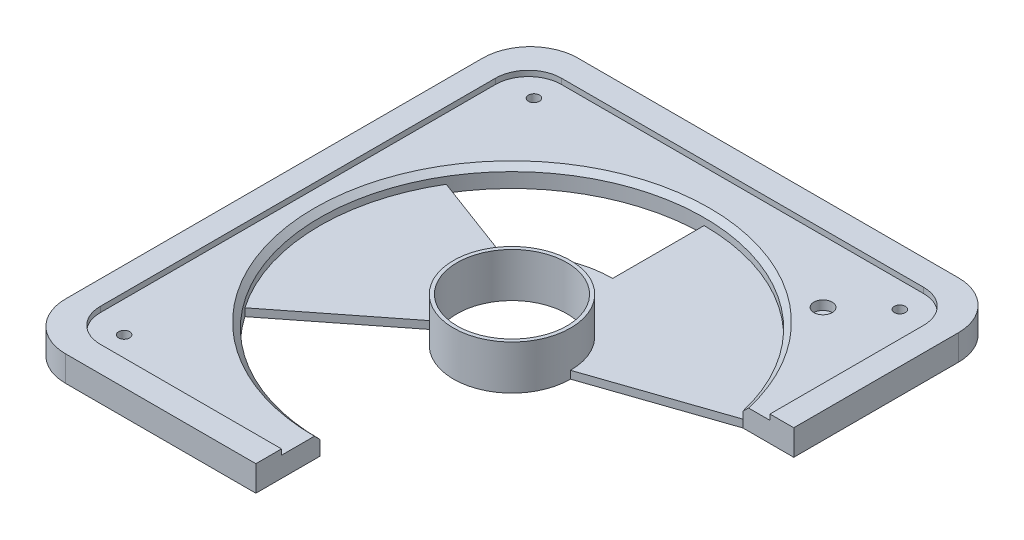
ISO-10303-21;
HEADER;
FILE_DESCRIPTION(('STEP AP214'),'2;1');
FILE_NAME('part.step','',(''),(''),'','','');
FILE_SCHEMA(('AUTOMOTIVE_DESIGN { 1 0 10303 214 1 1 1 1 }'));
ENDSEC;
DATA;
#1=APPLICATION_CONTEXT('core data for automotive mechanical design processes');
#2=APPLICATION_PROTOCOL_DEFINITION('international standard','automotive_design',2000,#1);
#3=PRODUCT_CONTEXT('',#1,'mechanical');
#4=PRODUCT('Part','Part','',(#3));
#5=PRODUCT_RELATED_PRODUCT_CATEGORY('part','',(#4));
#6=PRODUCT_DEFINITION_FORMATION('','',#4);
#7=PRODUCT_DEFINITION_CONTEXT('part definition',#1,'design');
#8=PRODUCT_DEFINITION('design','',#6,#7);
#9=PRODUCT_DEFINITION_SHAPE('','',#8);
#10=(LENGTH_UNIT() NAMED_UNIT(*) SI_UNIT(.MILLI.,.METRE.));
#11=(NAMED_UNIT(*) PLANE_ANGLE_UNIT() SI_UNIT($,.RADIAN.));
#12=(NAMED_UNIT(*) SI_UNIT($,.STERADIAN.) SOLID_ANGLE_UNIT());
#13=UNCERTAINTY_MEASURE_WITH_UNIT(LENGTH_MEASURE(1.E-05),#10,'distance_accuracy_value','');
#14=(GEOMETRIC_REPRESENTATION_CONTEXT(3) GLOBAL_UNCERTAINTY_ASSIGNED_CONTEXT((#13)) GLOBAL_UNIT_ASSIGNED_CONTEXT((#10,
#11,#12)) REPRESENTATION_CONTEXT('',''));
#15=CARTESIAN_POINT('',(0.,0.,0.));
#16=DIRECTION('',(0.,0.,1.));
#17=DIRECTION('',(1.,0.,0.));
#18=AXIS2_PLACEMENT_3D('',#15,#16,#17);
#19=CARTESIAN_POINT('',(0.,15.367,0.));
#20=DIRECTION('',(0.,-1.,0.));
#21=DIRECTION('',(0.,0.,-1.));
#22=AXIS2_PLACEMENT_3D('',#19,#20,#21);
#23=CYLINDRICAL_SURFACE('',#22,20.32);
#24=CARTESIAN_POINT('',(0.,2.667,0.));
#25=DIRECTION('',(0.,1.,0.));
#26=DIRECTION('',(0.,0.,1.));
#27=AXIS2_PLACEMENT_3D('',#24,#25,#26);
#28=CIRCLE('',#27,20.32);
#29=CARTESIAN_POINT('',(20.32,2.667,0.));
#30=VERTEX_POINT('',#29);
#31=CARTESIAN_POINT('',(-18.2721181038215,2.667,8.89));
#32=VERTEX_POINT('',#31);
#33=EDGE_CURVE('E450',#30,#32,#28,.T.);
#34=ORIENTED_EDGE('',*,*,#33,.T.);
#35=DIRECTION('',(0.,1.,0.));
#36=VECTOR('',#35,1.);
#37=CARTESIAN_POINT('',(-18.2721181038215,0.,8.89));
#38=LINE('',#37,#36);
#39=CARTESIAN_POINT('',(-18.2721181038215,0.,8.89));
#40=VERTEX_POINT('',#39);
#41=EDGE_CURVE('E380',#40,#32,#38,.T.);
#42=ORIENTED_EDGE('',*,*,#41,.F.);
#43=CARTESIAN_POINT('',(0.,0.,0.));
#44=DIRECTION('',(0.,-1.,0.));
#45=DIRECTION('',(0.,0.,1.));
#46=AXIS2_PLACEMENT_3D('',#43,#44,#45);
#47=CIRCLE('',#46,20.32);
#48=CARTESIAN_POINT('',(20.32,0.,0.));
#49=VERTEX_POINT('',#48);
#50=EDGE_CURVE('E375',#49,#40,#47,.T.);
#51=ORIENTED_EDGE('',*,*,#50,.F.);
#52=DIRECTION('',(0.,1.,0.));
#53=VECTOR('',#52,1.);
#54=CARTESIAN_POINT('',(20.32,0.,0.));
#55=LINE('',#54,#53);
#56=EDGE_CURVE('E379',#49,#30,#55,.T.);
#57=ORIENTED_EDGE('',*,*,#56,.T.);
#58=EDGE_LOOP('',(#34,#42,#51,#57));
#59=FACE_BOUND('',#58,.T.);
#60=CARTESIAN_POINT('',(0.,15.367,0.));
#61=DIRECTION('',(0.,1.,0.));
#62=DIRECTION('',(0.,0.,1.));
#63=AXIS2_PLACEMENT_3D('',#60,#61,#62);
#64=CIRCLE('',#63,20.32);
#65=CARTESIAN_POINT('',(0.,15.367,20.32));
#66=VERTEX_POINT('',#65);
#67=EDGE_CURVE('E458',#66,#66,#64,.T.);
#68=ORIENTED_EDGE('',*,*,#67,.F.);
#69=EDGE_LOOP('',(#68));
#70=FACE_BOUND('',#69,.T.);
#71=ADVANCED_FACE('F59',(#59,#70),#23,.T.);
#72=CARTESIAN_POINT('',(0.,15.367,0.));
#73=DIRECTION('',(0.,1.,0.));
#74=DIRECTION('',(0.,0.,1.));
#75=AXIS2_PLACEMENT_3D('',#72,#73,#74);
#76=PLANE('',#75);
#77=CARTESIAN_POINT('',(0.,15.367,0.));
#78=DIRECTION('',(0.,1.,0.));
#79=DIRECTION('',(0.,0.,1.));
#80=AXIS2_PLACEMENT_3D('',#77,#78,#79);
#81=CIRCLE('',#80,19.05);
#82=CARTESIAN_POINT('',(0.,15.367,19.05));
#83=VERTEX_POINT('',#82);
#84=EDGE_CURVE('E454',#83,#83,#81,.T.);
#85=ORIENTED_EDGE('',*,*,#84,.F.);
#86=EDGE_LOOP('',(#85));
#87=FACE_BOUND('',#86,.T.);
#88=ORIENTED_EDGE('',*,*,#67,.T.);
#89=EDGE_LOOP('',(#88));
#90=FACE_BOUND('',#89,.T.);
#91=ADVANCED_FACE('F741',(#87,#90),#76,.T.);
#92=CARTESIAN_POINT('',(0.,0.,0.));
#93=DIRECTION('',(0.,1.,0.));
#94=DIRECTION('',(0.,0.,1.));
#95=AXIS2_PLACEMENT_3D('',#92,#93,#94);
#96=CYLINDRICAL_SURFACE('',#95,19.05);
#97=ORIENTED_EDGE('',*,*,#84,.T.);
#98=EDGE_LOOP('',(#97));
#99=FACE_BOUND('',#98,.T.);
#100=CARTESIAN_POINT('',(0.,0.,0.));
#101=DIRECTION('',(0.,1.,0.));
#102=DIRECTION('',(0.,0.,1.));
#103=AXIS2_PLACEMENT_3D('',#100,#101,#102);
#104=CIRCLE('',#103,19.05);
#105=CARTESIAN_POINT('',(0.,0.,19.05));
#106=VERTEX_POINT('',#105);
#107=EDGE_CURVE('E371',#106,#106,#104,.T.);
#108=ORIENTED_EDGE('',*,*,#107,.F.);
#109=EDGE_LOOP('',(#108));
#110=FACE_BOUND('',#109,.T.);
#111=ADVANCED_FACE('F746',(#99,#110),#96,.F.);
#112=CARTESIAN_POINT('',(0.,2.667,0.));
#113=DIRECTION('',(0.,1.,0.));
#114=DIRECTION('',(0.,0.,1.));
#115=AXIS2_PLACEMENT_3D('',#112,#113,#114);
#116=PLANE('',#115);
#117=DIRECTION('',(-0.786455058873428,0.,0.61764750495116));
#118=VECTOR('',#117,1.);
#119=CARTESIAN_POINT('',(-2.65226651443814,2.667,-3.37715023705213));
#120=LINE('',#119,#118);
#121=CARTESIAN_POINT('',(-54.9802934150046,2.667,37.719));
#122=VERTEX_POINT('',#121);
#123=EDGE_CURVE('E388',#32,#122,#120,.T.);
#124=ORIENTED_EDGE('',*,*,#123,.F.);
#125=ORIENTED_EDGE('',*,*,#33,.F.);
#126=DIRECTION('',(0.94625784113902,0.,-0.323413200229862));
#127=VECTOR('',#126,1.);
#128=CARTESIAN_POINT('',(2.12539271304495,2.667,6.21857586143393));
#129=LINE('',#128,#127);
#130=CARTESIAN_POINT('',(64.9099223924971,2.667,-15.24));
#131=VERTEX_POINT('',#130);
#132=EDGE_CURVE('E392',#30,#131,#129,.T.);
#133=ORIENTED_EDGE('',*,*,#132,.T.);
#134=CARTESIAN_POINT('',(0.,2.667,0.));
#135=DIRECTION('',(0.,1.,0.));
#136=DIRECTION('',(0.,0.,1.));
#137=AXIS2_PLACEMENT_3D('',#134,#135,#136);
#138=CIRCLE('',#137,66.675);
#139=CARTESIAN_POINT('',(0.,2.667,-66.675));
#140=VERTEX_POINT('',#139);
#141=EDGE_CURVE('E402',#131,#140,#138,.T.);
#142=ORIENTED_EDGE('',*,*,#141,.T.);
#143=DIRECTION('',(0.,0.,1.));
#144=VECTOR('',#143,1.);
#145=CARTESIAN_POINT('',(0.,2.667,0.));
#146=LINE('',#145,#144);
#147=CARTESIAN_POINT('',(0.,2.667,-34.925));
#148=VERTEX_POINT('',#147);
#149=EDGE_CURVE('E398',#140,#148,#146,.T.);
#150=ORIENTED_EDGE('',*,*,#149,.T.);
#151=CARTESIAN_POINT('',(0.,2.667,0.));
#152=DIRECTION('',(0.,1.,0.));
#153=DIRECTION('',(0.,0.,1.));
#154=AXIS2_PLACEMENT_3D('',#151,#152,#153);
#155=CIRCLE('',#154,34.925);
#156=CARTESIAN_POINT('',(-26.4040910655906,2.667,-22.86));
#157=VERTEX_POINT('',#156);
#158=EDGE_CURVE('E394',#148,#157,#155,.T.);
#159=ORIENTED_EDGE('',*,*,#158,.T.);
#160=DIRECTION('',(-0.93679754721467,0.,-0.349871913037583));
#161=VECTOR('',#160,1.);
#162=CARTESIAN_POINT('',(4.26043999352726,2.667,-11.4075168290599));
#163=LINE('',#162,#161);
#164=CARTESIAN_POINT('',(-57.15,2.667,-34.3428758987945));
#165=VERTEX_POINT('',#164);
#166=EDGE_CURVE('E397',#157,#165,#163,.T.);
#167=ORIENTED_EDGE('',*,*,#166,.T.);
#168=CARTESIAN_POINT('',(0.,2.667,0.));
#169=DIRECTION('',(0.,1.,0.));
#170=DIRECTION('',(0.,0.,1.));
#171=AXIS2_PLACEMENT_3D('',#168,#169,#170);
#172=CIRCLE('',#171,66.675);
#173=EDGE_CURVE('E409',#165,#122,#172,.T.);
#174=ORIENTED_EDGE('',*,*,#173,.T.);
#175=EDGE_LOOP('',(#124,#125,#133,#142,#150,#159,#167,#174));
#176=FACE_BOUND('',#175,.T.);
#177=ADVANCED_FACE('F653',(#176),#116,.T.);
#178=CARTESIAN_POINT('',(-2.65226651443814,2.667,-3.37715023705213));
#179=DIRECTION('',(0.61764750495116,0.,0.786455058873428));
#180=DIRECTION('',(0.786455058873428,0.,-0.61764750495116));
#181=AXIS2_PLACEMENT_3D('',#178,#179,#180);
#182=PLANE('',#181);
#183=DIRECTION('',(-0.786455058873428,0.,0.61764750495116));
#184=VECTOR('',#183,1.);
#185=CARTESIAN_POINT('',(-2.65226651443814,0.,-3.37715023705213));
#186=LINE('',#185,#184);
#187=CARTESIAN_POINT('',(-54.9802934150046,0.,37.719));
#188=VERTEX_POINT('',#187);
#189=EDGE_CURVE('E384',#40,#188,#186,.T.);
#190=ORIENTED_EDGE('',*,*,#189,.F.);
#191=ORIENTED_EDGE('',*,*,#41,.T.);
#192=ORIENTED_EDGE('',*,*,#123,.T.);
#193=DIRECTION('',(0.,-1.,0.));
#194=VECTOR('',#193,1.);
#195=CARTESIAN_POINT('',(-54.9802934150046,2.667,37.719));
#196=LINE('',#195,#194);
#197=EDGE_CURVE('E412',#122,#188,#196,.T.);
#198=ORIENTED_EDGE('',*,*,#197,.T.);
#199=EDGE_LOOP('',(#190,#191,#192,#198));
#200=FACE_BOUND('',#199,.T.);
#201=ADVANCED_FACE('F726',(#200),#182,.T.);
#202=CARTESIAN_POINT('',(2.12539271304495,2.667,6.21857586143393));
#203=DIRECTION('',(-0.323413200229862,0.,-0.94625784113902));
#204=DIRECTION('',(-0.94625784113902,0.,0.323413200229862));
#205=AXIS2_PLACEMENT_3D('',#202,#203,#204);
#206=PLANE('',#205);
#207=DIRECTION('',(0.94625784113902,0.,-0.323413200229862));
#208=VECTOR('',#207,1.);
#209=CARTESIAN_POINT('',(2.12539271304495,0.,6.21857586143393));
#210=LINE('',#209,#208);
#211=CARTESIAN_POINT('',(64.9099223924971,0.,-15.24));
#212=VERTEX_POINT('',#211);
#213=EDGE_CURVE('E415',#49,#212,#210,.T.);
#214=ORIENTED_EDGE('',*,*,#213,.T.);
#215=DIRECTION('',(0.,-1.,0.));
#216=VECTOR('',#215,1.);
#217=CARTESIAN_POINT('',(64.9099223924971,2.667,-15.24));
#218=LINE('',#217,#216);
#219=EDGE_CURVE('E446',#131,#212,#218,.T.);
#220=ORIENTED_EDGE('',*,*,#219,.F.);
#221=ORIENTED_EDGE('',*,*,#132,.F.);
#222=ORIENTED_EDGE('',*,*,#56,.F.);
#223=EDGE_LOOP('',(#214,#220,#221,#222));
#224=FACE_BOUND('',#223,.T.);
#225=ADVANCED_FACE('F731',(#224),#206,.F.);
#226=CARTESIAN_POINT('',(0.,2.667,0.));
#227=DIRECTION('',(1.,0.,0.));
#228=DIRECTION('',(0.,0.,-1.));
#229=AXIS2_PLACEMENT_3D('',#226,#227,#228);
#230=PLANE('',#229);
#231=DIRECTION('',(0.,0.,1.));
#232=VECTOR('',#231,1.);
#233=CARTESIAN_POINT('',(0.,0.,0.));
#234=LINE('',#233,#232);
#235=CARTESIAN_POINT('',(0.,0.,-66.675));
#236=VERTEX_POINT('',#235);
#237=CARTESIAN_POINT('',(0.,0.,-34.925));
#238=VERTEX_POINT('',#237);
#239=EDGE_CURVE('E419',#236,#238,#234,.T.);
#240=ORIENTED_EDGE('',*,*,#239,.T.);
#241=DIRECTION('',(0.,-1.,0.));
#242=VECTOR('',#241,1.);
#243=CARTESIAN_POINT('',(0.,2.667,-34.925));
#244=LINE('',#243,#242);
#245=EDGE_CURVE('E438',#148,#238,#244,.T.);
#246=ORIENTED_EDGE('',*,*,#245,.F.);
#247=ORIENTED_EDGE('',*,*,#149,.F.);
#248=DIRECTION('',(0.,-1.,0.));
#249=VECTOR('',#248,1.);
#250=CARTESIAN_POINT('',(0.,2.667,-66.675));
#251=LINE('',#250,#249);
#252=EDGE_CURVE('E442',#140,#236,#251,.T.);
#253=ORIENTED_EDGE('',*,*,#252,.T.);
#254=EDGE_LOOP('',(#240,#246,#247,#253));
#255=FACE_BOUND('',#254,.T.);
#256=ADVANCED_FACE('F651',(#255),#230,.F.);
#257=CARTESIAN_POINT('',(0.,2.667,0.));
#258=DIRECTION('',(0.,-1.,0.));
#259=DIRECTION('',(0.,0.,-1.));
#260=AXIS2_PLACEMENT_3D('',#257,#258,#259);
#261=CYLINDRICAL_SURFACE('',#260,34.925);
#262=CARTESIAN_POINT('',(0.,0.,0.));
#263=DIRECTION('',(0.,1.,0.));
#264=DIRECTION('',(0.,0.,1.));
#265=AXIS2_PLACEMENT_3D('',#262,#263,#264);
#266=CIRCLE('',#265,34.925);
#267=CARTESIAN_POINT('',(-26.4040910655906,0.,-22.86));
#268=VERTEX_POINT('',#267);
#269=EDGE_CURVE('E416',#238,#268,#266,.T.);
#270=ORIENTED_EDGE('',*,*,#269,.T.);
#271=DIRECTION('',(0.,-1.,0.));
#272=VECTOR('',#271,1.);
#273=CARTESIAN_POINT('',(-26.4040910655906,2.667,-22.86));
#274=LINE('',#273,#272);
#275=EDGE_CURVE('E434',#157,#268,#274,.T.);
#276=ORIENTED_EDGE('',*,*,#275,.F.);
#277=ORIENTED_EDGE('',*,*,#158,.F.);
#278=ORIENTED_EDGE('',*,*,#245,.T.);
#279=EDGE_LOOP('',(#270,#276,#277,#278));
#280=FACE_BOUND('',#279,.T.);
#281=ADVANCED_FACE('F647',(#280),#261,.T.);
#282=CARTESIAN_POINT('',(4.26043999352726,2.667,-11.4075168290599));
#283=DIRECTION('',(-0.349871913037583,0.,0.93679754721467));
#284=DIRECTION('',(0.93679754721467,0.,0.349871913037583));
#285=AXIS2_PLACEMENT_3D('',#282,#283,#284);
#286=PLANE('',#285);
#287=DIRECTION('',(-0.93679754721467,0.,-0.349871913037583));
#288=VECTOR('',#287,1.);
#289=CARTESIAN_POINT('',(4.26043999352726,0.,-11.4075168290599));
#290=LINE('',#289,#288);
#291=CARTESIAN_POINT('',(-57.15,0.,-34.3428758987945));
#292=VERTEX_POINT('',#291);
#293=EDGE_CURVE('E393',#268,#292,#290,.T.);
#294=ORIENTED_EDGE('',*,*,#293,.T.);
#295=DIRECTION('',(0.,-1.,0.));
#296=VECTOR('',#295,1.);
#297=CARTESIAN_POINT('',(-57.15,2.667,-34.3428758987945));
#298=LINE('',#297,#296);
#299=EDGE_CURVE('E430',#165,#292,#298,.T.);
#300=ORIENTED_EDGE('',*,*,#299,.F.);
#301=ORIENTED_EDGE('',*,*,#166,.F.);
#302=ORIENTED_EDGE('',*,*,#275,.T.);
#303=EDGE_LOOP('',(#294,#300,#301,#302));
#304=FACE_BOUND('',#303,.T.);
#305=ADVANCED_FACE('F643',(#304),#286,.F.);
#306=CARTESIAN_POINT('',(0.,0.,0.));
#307=DIRECTION('',(0.,1.,0.));
#308=DIRECTION('',(0.,0.,1.));
#309=AXIS2_PLACEMENT_3D('',#306,#307,#308);
#310=PLANE('',#309);
#311=CARTESIAN_POINT('',(63.5,0.,-71.12));
#312=DIRECTION('',(0.,1.,0.));
#313=DIRECTION('',(0.,0.,1.));
#314=AXIS2_PLACEMENT_3D('',#311,#312,#313);
#315=CIRCLE('',#314,1.90500000000001);
#316=CARTESIAN_POINT('',(63.5,0.,-69.215));
#317=VERTEX_POINT('',#316);
#318=EDGE_CURVE('E272',#317,#317,#315,.T.);
#319=ORIENTED_EDGE('',*,*,#318,.T.);
#320=EDGE_LOOP('',(#319));
#321=FACE_BOUND('',#320,.T.);
#322=CARTESIAN_POINT('',(-63.5,0.,-71.12));
#323=DIRECTION('',(0.,1.,0.));
#324=DIRECTION('',(0.,0.,1.));
#325=AXIS2_PLACEMENT_3D('',#322,#323,#324);
#326=CIRCLE('',#325,1.90500000000001);
#327=CARTESIAN_POINT('',(-63.5,0.,-69.215));
#328=VERTEX_POINT('',#327);
#329=EDGE_CURVE('E987',#328,#328,#326,.T.);
#330=ORIENTED_EDGE('',*,*,#329,.T.);
#331=EDGE_LOOP('',(#330));
#332=FACE_BOUND('',#331,.T.);
#333=CARTESIAN_POINT('',(-63.5,0.,71.12));
#334=DIRECTION('',(0.,1.,0.));
#335=DIRECTION('',(0.,0.,1.));
#336=AXIS2_PLACEMENT_3D('',#333,#334,#335);
#337=CIRCLE('',#336,1.90500000000001);
#338=CARTESIAN_POINT('',(-63.5,0.,73.025));
#339=VERTEX_POINT('',#338);
#340=EDGE_CURVE('E282',#339,#339,#337,.T.);
#341=ORIENTED_EDGE('',*,*,#340,.T.);
#342=EDGE_LOOP('',(#341));
#343=FACE_BOUND('',#342,.T.);
#344=DIRECTION('',(1.,0.,0.));
#345=VECTOR('',#344,1.);
#346=CARTESIAN_POINT('',(-82.55,0.,88.9));
#347=LINE('',#346,#345);
#348=CARTESIAN_POINT('',(-66.04,0.,88.9));
#349=VERTEX_POINT('',#348);
#350=CARTESIAN_POINT('',(0.,0.,88.9));
#351=VERTEX_POINT('',#350);
#352=EDGE_CURVE('E364',#349,#351,#347,.T.);
#353=ORIENTED_EDGE('',*,*,#352,.F.);
#354=CARTESIAN_POINT('',(-66.04,0.,72.39));
#355=DIRECTION('',(0.,1.,0.));
#356=DIRECTION('',(0.,0.,1.));
#357=AXIS2_PLACEMENT_3D('',#354,#355,#356);
#358=CIRCLE('',#357,16.51);
#359=CARTESIAN_POINT('',(-82.55,0.,72.39));
#360=VERTEX_POINT('',#359);
#361=EDGE_CURVE('E472',#349,#360,#358,.F.);
#362=ORIENTED_EDGE('',*,*,#361,.T.);
#363=DIRECTION('',(0.,0.,-1.));
#364=VECTOR('',#363,1.);
#365=CARTESIAN_POINT('',(-82.55,0.,88.9));
#366=LINE('',#365,#364);
#367=CARTESIAN_POINT('',(-82.55,0.,-72.39));
#368=VERTEX_POINT('',#367);
#369=EDGE_CURVE('E367',#360,#368,#366,.T.);
#370=ORIENTED_EDGE('',*,*,#369,.T.);
#371=CARTESIAN_POINT('',(-66.04,0.,-72.39));
#372=DIRECTION('',(0.,1.,0.));
#373=DIRECTION('',(0.,0.,1.));
#374=AXIS2_PLACEMENT_3D('',#371,#372,#373);
#375=CIRCLE('',#374,16.51);
#376=CARTESIAN_POINT('',(-66.04,0.,-88.9));
#377=VERTEX_POINT('',#376);
#378=EDGE_CURVE('E466',#368,#377,#375,.F.);
#379=ORIENTED_EDGE('',*,*,#378,.T.);
#380=DIRECTION('',(1.,0.,0.));
#381=VECTOR('',#380,1.);
#382=CARTESIAN_POINT('',(-82.55,0.,-88.9));
#383=LINE('',#382,#381);
#384=CARTESIAN_POINT('',(66.04,0.,-88.9));
#385=VERTEX_POINT('',#384);
#386=EDGE_CURVE('E356',#377,#385,#383,.T.);
#387=ORIENTED_EDGE('',*,*,#386,.T.);
#388=CARTESIAN_POINT('',(66.04,0.,-72.39));
#389=DIRECTION('',(0.,1.,0.));
#390=DIRECTION('',(0.,0.,1.));
#391=AXIS2_PLACEMENT_3D('',#388,#389,#390);
#392=CIRCLE('',#391,16.51);
#393=CARTESIAN_POINT('',(82.55,0.,-72.39));
#394=VERTEX_POINT('',#393);
#395=EDGE_CURVE('E469',#385,#394,#392,.F.);
#396=ORIENTED_EDGE('',*,*,#395,.T.);
#397=DIRECTION('',(0.,0.,-1.));
#398=VECTOR('',#397,1.);
#399=CARTESIAN_POINT('',(82.55,0.,88.9));
#400=LINE('',#399,#398);
#401=CARTESIAN_POINT('',(82.55,0.,-15.24));
#402=VERTEX_POINT('',#401);
#403=EDGE_CURVE('E360',#402,#394,#400,.T.);
#404=ORIENTED_EDGE('',*,*,#403,.F.);
#405=DIRECTION('',(-1.,0.,0.));
#406=VECTOR('',#405,1.);
#407=CARTESIAN_POINT('',(64.9099223924971,0.,-15.24));
#408=LINE('',#407,#406);
#409=EDGE_CURVE('E292',#402,#212,#408,.T.);
#410=ORIENTED_EDGE('',*,*,#409,.T.);
#411=ORIENTED_EDGE('',*,*,#213,.F.);
#412=ORIENTED_EDGE('',*,*,#50,.T.);
#413=ORIENTED_EDGE('',*,*,#189,.T.);
#414=CARTESIAN_POINT('',(0.,0.,0.));
#415=DIRECTION('',(0.,1.,0.));
#416=DIRECTION('',(0.,0.,1.));
#417=AXIS2_PLACEMENT_3D('',#414,#415,#416);
#418=CIRCLE('',#417,66.675);
#419=CARTESIAN_POINT('',(0.,0.,66.675));
#420=VERTEX_POINT('',#419);
#421=EDGE_CURVE('E351',#188,#420,#418,.T.);
#422=ORIENTED_EDGE('',*,*,#421,.T.);
#423=DIRECTION('',(0.,0.,1.));
#424=VECTOR('',#423,1.);
#425=CARTESIAN_POINT('',(0.,0.,66.675));
#426=LINE('',#425,#424);
#427=EDGE_CURVE('E288',#420,#351,#426,.T.);
#428=ORIENTED_EDGE('',*,*,#427,.T.);
#429=EDGE_LOOP('',(#353,#362,#370,#379,#387,#396,#404,#410,#411,#412,#413,#422,#428));
#430=FACE_BOUND('',#429,.T.);
#431=ORIENTED_EDGE('',*,*,#107,.T.);
#432=EDGE_LOOP('',(#431));
#433=FACE_BOUND('',#432,.T.);
#434=EDGE_CURVE('E355',#236,#292,#418,.T.);
#435=ORIENTED_EDGE('',*,*,#434,.T.);
#436=ORIENTED_EDGE('',*,*,#293,.F.);
#437=ORIENTED_EDGE('',*,*,#269,.F.);
#438=ORIENTED_EDGE('',*,*,#239,.F.);
#439=EDGE_LOOP('',(#435,#436,#437,#438));
#440=FACE_BOUND('',#439,.T.);
#441=ADVANCED_FACE('F632',(#321,#332,#343,#430,#433,#440),#310,.F.);
#442=CARTESIAN_POINT('',(0.,6.985,0.));
#443=DIRECTION('',(0.,-1.,0.));
#444=DIRECTION('',(0.,0.,-1.));
#445=AXIS2_PLACEMENT_3D('',#442,#443,#444);
#446=CYLINDRICAL_SURFACE('',#445,66.675);
#447=DIRECTION('',(0.,1.,0.));
#448=VECTOR('',#447,1.);
#449=CARTESIAN_POINT('',(64.9099223924971,0.,-15.24));
#450=LINE('',#449,#448);
#451=CARTESIAN_POINT('',(64.9099223924971,5.07999999999995,-15.24));
#452=VERTEX_POINT('',#451);
#453=EDGE_CURVE('E301',#131,#452,#450,.T.);
#454=ORIENTED_EDGE('',*,*,#453,.T.);
#455=CARTESIAN_POINT('',(0.,5.07999999999995,0.));
#456=DIRECTION('',(0.,1.,0.));
#457=DIRECTION('',(0.,0.,1.));
#458=AXIS2_PLACEMENT_3D('',#455,#456,#457);
#459=CIRCLE('',#458,66.675);
#460=CARTESIAN_POINT('',(0.,5.07999999999995,66.675));
#461=VERTEX_POINT('',#460);
#462=EDGE_CURVE('E539',#452,#461,#459,.T.);
#463=ORIENTED_EDGE('',*,*,#462,.T.);
#464=DIRECTION('',(0.,1.,0.));
#465=VECTOR('',#464,1.);
#466=CARTESIAN_POINT('',(0.,0.,66.675));
#467=LINE('',#466,#465);
#468=EDGE_CURVE('E296',#420,#461,#467,.T.);
#469=ORIENTED_EDGE('',*,*,#468,.F.);
#470=ORIENTED_EDGE('',*,*,#421,.F.);
#471=ORIENTED_EDGE('',*,*,#197,.F.);
#472=ORIENTED_EDGE('',*,*,#173,.F.);
#473=ORIENTED_EDGE('',*,*,#299,.T.);
#474=ORIENTED_EDGE('',*,*,#434,.F.);
#475=ORIENTED_EDGE('',*,*,#252,.F.);
#476=ORIENTED_EDGE('',*,*,#141,.F.);
#477=EDGE_LOOP('',(#454,#463,#469,#470,#471,#472,#473,#474,#475,#476));
#478=FACE_BOUND('',#477,.T.);
#479=ADVANCED_FACE('F636',(#478),#446,.F.);
#480=CARTESIAN_POINT('',(0.,6.985,0.));
#481=DIRECTION('',(0.,1.,0.));
#482=DIRECTION('',(0.,0.,1.));
#483=AXIS2_PLACEMENT_3D('',#480,#481,#482);
#484=PLANE('',#483);
#485=CARTESIAN_POINT('',(49.53,6.985,-58.42));
#486=DIRECTION('',(0.,1.,0.));
#487=DIRECTION('',(0.,0.,1.));
#488=AXIS2_PLACEMENT_3D('',#485,#486,#487);
#489=CIRCLE('',#488,3.175);
#490=CARTESIAN_POINT('',(49.53,6.985,-55.245));
#491=VERTEX_POINT('',#490);
#492=EDGE_CURVE('E970',#491,#491,#489,.T.);
#493=ORIENTED_EDGE('',*,*,#492,.F.);
#494=EDGE_LOOP('',(#493));
#495=FACE_BOUND('',#494,.T.);
#496=CARTESIAN_POINT('',(63.5,6.985,-71.12));
#497=DIRECTION('',(0.,1.,0.));
#498=DIRECTION('',(0.,0.,1.));
#499=AXIS2_PLACEMENT_3D('',#496,#497,#498);
#500=CIRCLE('',#499,1.90500000000001);
#501=CARTESIAN_POINT('',(63.5,6.985,-69.215));
#502=VERTEX_POINT('',#501);
#503=EDGE_CURVE('E279',#502,#502,#500,.T.);
#504=ORIENTED_EDGE('',*,*,#503,.F.);
#505=EDGE_LOOP('',(#504));
#506=FACE_BOUND('',#505,.T.);
#507=CARTESIAN_POINT('',(-63.5,6.985,-71.12));
#508=DIRECTION('',(0.,1.,0.));
#509=DIRECTION('',(0.,0.,1.));
#510=AXIS2_PLACEMENT_3D('',#507,#508,#509);
#511=CIRCLE('',#510,1.90500000000001);
#512=CARTESIAN_POINT('',(-63.5,6.985,-69.215));
#513=VERTEX_POINT('',#512);
#514=EDGE_CURVE('E983',#513,#513,#511,.T.);
#515=ORIENTED_EDGE('',*,*,#514,.F.);
#516=EDGE_LOOP('',(#515));
#517=FACE_BOUND('',#516,.T.);
#518=CARTESIAN_POINT('',(-63.5,6.985,71.12));
#519=DIRECTION('',(0.,1.,0.));
#520=DIRECTION('',(0.,0.,1.));
#521=AXIS2_PLACEMENT_3D('',#518,#519,#520);
#522=CIRCLE('',#521,1.90500000000001);
#523=CARTESIAN_POINT('',(-63.5,6.985,73.025));
#524=VERTEX_POINT('',#523);
#525=EDGE_CURVE('E976',#524,#524,#522,.T.);
#526=ORIENTED_EDGE('',*,*,#525,.F.);
#527=EDGE_LOOP('',(#526));
#528=FACE_BOUND('',#527,.T.);
#529=DIRECTION('',(0.,0.,1.));
#530=VECTOR('',#529,1.);
#531=CARTESIAN_POINT('',(0.,6.985,66.675));
#532=LINE('',#531,#530);
#533=CARTESIAN_POINT('',(0.,6.985,68.5800000000001));
#534=VERTEX_POINT('',#533);
#535=CARTESIAN_POINT('',(0.,6.985,80.01));
#536=VERTEX_POINT('',#535);
#537=EDGE_CURVE('E260',#534,#536,#532,.T.);
#538=ORIENTED_EDGE('',*,*,#537,.F.);
#539=CARTESIAN_POINT('',(0.,6.985,0.));
#540=DIRECTION('',(0.,1.,0.));
#541=DIRECTION('',(0.,0.,1.));
#542=AXIS2_PLACEMENT_3D('',#539,#540,#541);
#543=CIRCLE('',#542,68.5800000000001);
#544=CARTESIAN_POINT('',(66.8652286319281,6.985,-15.24));
#545=VERTEX_POINT('',#544);
#546=EDGE_CURVE('E75',#534,#545,#543,.F.);
#547=ORIENTED_EDGE('',*,*,#546,.T.);
#548=DIRECTION('',(-1.,0.,0.));
#549=VECTOR('',#548,1.);
#550=CARTESIAN_POINT('',(64.9099223924971,6.985,-15.24));
#551=LINE('',#550,#549);
#552=CARTESIAN_POINT('',(74.295,6.985,-15.24));
#553=VERTEX_POINT('',#552);
#554=EDGE_CURVE('E293',#553,#545,#551,.T.);
#555=ORIENTED_EDGE('',*,*,#554,.F.);
#556=DIRECTION('',(0.,0.,-1.));
#557=VECTOR('',#556,1.);
#558=CARTESIAN_POINT('',(74.295,6.985,80.01));
#559=LINE('',#558,#557);
#560=CARTESIAN_POINT('',(74.295,6.985,-68.58));
#561=VERTEX_POINT('',#560);
#562=EDGE_CURVE('E305',#553,#561,#559,.T.);
#563=ORIENTED_EDGE('',*,*,#562,.T.);
#564=CARTESIAN_POINT('',(62.865,6.985,-68.58));
#565=DIRECTION('',(0.,1.,0.));
#566=DIRECTION('',(0.,0.,1.));
#567=AXIS2_PLACEMENT_3D('',#564,#565,#566);
#568=CIRCLE('',#567,11.43);
#569=CARTESIAN_POINT('',(62.865,6.985,-80.01));
#570=VERTEX_POINT('',#569);
#571=EDGE_CURVE('E511',#561,#570,#568,.T.);
#572=ORIENTED_EDGE('',*,*,#571,.T.);
#573=DIRECTION('',(-1.,0.,0.));
#574=VECTOR('',#573,1.);
#575=CARTESIAN_POINT('',(-74.295,6.985,-80.01));
#576=LINE('',#575,#574);
#577=CARTESIAN_POINT('',(-62.865,6.985,-80.01));
#578=VERTEX_POINT('',#577);
#579=EDGE_CURVE('E329',#570,#578,#576,.T.);
#580=ORIENTED_EDGE('',*,*,#579,.T.);
#581=CARTESIAN_POINT('',(-62.865,6.985,-68.58));
#582=DIRECTION('',(0.,1.,0.));
#583=DIRECTION('',(0.,0.,1.));
#584=AXIS2_PLACEMENT_3D('',#581,#582,#583);
#585=CIRCLE('',#584,11.43);
#586=CARTESIAN_POINT('',(-74.295,6.985,-68.58));
#587=VERTEX_POINT('',#586);
#588=EDGE_CURVE('E508',#578,#587,#585,.T.);
#589=ORIENTED_EDGE('',*,*,#588,.T.);
#590=DIRECTION('',(0.,0.,1.));
#591=VECTOR('',#590,1.);
#592=CARTESIAN_POINT('',(-74.295,6.985,80.01));
#593=LINE('',#592,#591);
#594=CARTESIAN_POINT('',(-74.295,6.985,68.58));
#595=VERTEX_POINT('',#594);
#596=EDGE_CURVE('E333',#587,#595,#593,.T.);
#597=ORIENTED_EDGE('',*,*,#596,.T.);
#598=CARTESIAN_POINT('',(-62.865,6.985,68.58));
#599=DIRECTION('',(0.,1.,0.));
#600=DIRECTION('',(0.,0.,1.));
#601=AXIS2_PLACEMENT_3D('',#598,#599,#600);
#602=CIRCLE('',#601,11.43);
#603=CARTESIAN_POINT('',(-62.865,6.985,80.01));
#604=VERTEX_POINT('',#603);
#605=EDGE_CURVE('E514',#595,#604,#602,.T.);
#606=ORIENTED_EDGE('',*,*,#605,.T.);
#607=DIRECTION('',(1.,0.,0.));
#608=VECTOR('',#607,1.);
#609=CARTESIAN_POINT('',(-74.295,6.985,80.01));
#610=LINE('',#609,#608);
#611=EDGE_CURVE('E319',#604,#536,#610,.T.);
#612=ORIENTED_EDGE('',*,*,#611,.T.);
#613=EDGE_LOOP('',(#538,#547,#555,#563,#572,#580,#589,#597,#606,#612));
#614=FACE_BOUND('',#613,.T.);
#615=ADVANCED_FACE('F663',(#495,#506,#517,#528,#614),#484,.T.);
#616=CARTESIAN_POINT('',(-82.55,6.985,-88.9));
#617=DIRECTION('',(0.,0.,-1.));
#618=DIRECTION('',(-1.,0.,0.));
#619=AXIS2_PLACEMENT_3D('',#616,#617,#618);
#620=PLANE('',#619);
#621=DIRECTION('',(-1.,0.,0.));
#622=VECTOR('',#621,1.);
#623=CARTESIAN_POINT('',(-82.55,8.89,-88.9));
#624=LINE('',#623,#622);
#625=CARTESIAN_POINT('',(66.04,8.89,-88.9));
#626=VERTEX_POINT('',#625);
#627=CARTESIAN_POINT('',(-66.04,8.89,-88.9));
#628=VERTEX_POINT('',#627);
#629=EDGE_CURVE('E342',#626,#628,#624,.T.);
#630=ORIENTED_EDGE('',*,*,#629,.F.);
#631=DIRECTION('',(0.,-1.,0.));
#632=VECTOR('',#631,1.);
#633=CARTESIAN_POINT('',(66.04,0.,-88.9));
#634=LINE('',#633,#632);
#635=EDGE_CURVE('E494',#626,#385,#634,.T.);
#636=ORIENTED_EDGE('',*,*,#635,.T.);
#637=ORIENTED_EDGE('',*,*,#386,.F.);
#638=DIRECTION('',(0.,-1.,0.));
#639=VECTOR('',#638,1.);
#640=CARTESIAN_POINT('',(-66.04,6.985,-88.9));
#641=LINE('',#640,#639);
#642=EDGE_CURVE('E491',#377,#628,#641,.F.);
#643=ORIENTED_EDGE('',*,*,#642,.T.);
#644=EDGE_LOOP('',(#630,#636,#637,#643));
#645=FACE_BOUND('',#644,.T.);
#646=ADVANCED_FACE('F702',(#645),#620,.T.);
#647=CARTESIAN_POINT('',(-82.55,6.985,88.9));
#648=DIRECTION('',(-1.,0.,0.));
#649=DIRECTION('',(0.,0.,1.));
#650=AXIS2_PLACEMENT_3D('',#647,#648,#649);
#651=PLANE('',#650);
#652=ORIENTED_EDGE('',*,*,#369,.F.);
#653=DIRECTION('',(0.,-1.,0.));
#654=VECTOR('',#653,1.);
#655=CARTESIAN_POINT('',(-82.55,8.89,72.39));
#656=LINE('',#655,#654);
#657=CARTESIAN_POINT('',(-82.55,8.89,72.39));
#658=VERTEX_POINT('',#657);
#659=EDGE_CURVE('E479',#360,#658,#656,.F.);
#660=ORIENTED_EDGE('',*,*,#659,.T.);
#661=DIRECTION('',(0.,0.,1.));
#662=VECTOR('',#661,1.);
#663=CARTESIAN_POINT('',(-82.55,8.89,88.9));
#664=LINE('',#663,#662);
#665=CARTESIAN_POINT('',(-82.55,8.89,-72.39));
#666=VERTEX_POINT('',#665);
#667=EDGE_CURVE('E346',#666,#658,#664,.T.);
#668=ORIENTED_EDGE('',*,*,#667,.F.);
#669=DIRECTION('',(0.,-1.,0.));
#670=VECTOR('',#669,1.);
#671=CARTESIAN_POINT('',(-82.55,6.985,-72.39));
#672=LINE('',#671,#670);
#673=EDGE_CURVE('E475',#666,#368,#672,.T.);
#674=ORIENTED_EDGE('',*,*,#673,.T.);
#675=EDGE_LOOP('',(#652,#660,#668,#674));
#676=FACE_BOUND('',#675,.T.);
#677=ADVANCED_FACE('F712',(#676),#651,.T.);
#678=CARTESIAN_POINT('',(-82.55,6.985,88.9));
#679=DIRECTION('',(0.,0.,-1.));
#680=DIRECTION('',(-1.,0.,0.));
#681=AXIS2_PLACEMENT_3D('',#678,#679,#680);
#682=PLANE('',#681);
#683=DIRECTION('',(1.,0.,0.));
#684=VECTOR('',#683,1.);
#685=CARTESIAN_POINT('',(-82.55,8.89,88.9));
#686=LINE('',#685,#684);
#687=CARTESIAN_POINT('',(-66.04,8.89,88.9));
#688=VERTEX_POINT('',#687);
#689=CARTESIAN_POINT('',(0.,8.89,88.9));
#690=VERTEX_POINT('',#689);
#691=EDGE_CURVE('E269',#688,#690,#686,.T.);
#692=ORIENTED_EDGE('',*,*,#691,.F.);
#693=DIRECTION('',(0.,-1.,0.));
#694=VECTOR('',#693,1.);
#695=CARTESIAN_POINT('',(-66.04,0.,88.9));
#696=LINE('',#695,#694);
#697=EDGE_CURVE('E462',#688,#349,#696,.T.);
#698=ORIENTED_EDGE('',*,*,#697,.T.);
#699=ORIENTED_EDGE('',*,*,#352,.T.);
#700=DIRECTION('',(0.,1.,0.));
#701=VECTOR('',#700,1.);
#702=CARTESIAN_POINT('',(0.,0.,88.9));
#703=LINE('',#702,#701);
#704=EDGE_CURVE('E309',#351,#690,#703,.T.);
#705=ORIENTED_EDGE('',*,*,#704,.T.);
#706=EDGE_LOOP('',(#692,#698,#699,#705));
#707=FACE_BOUND('',#706,.T.);
#708=ADVANCED_FACE('F718',(#707),#682,.F.);
#709=CARTESIAN_POINT('',(82.55,6.985,88.9));
#710=DIRECTION('',(-1.,0.,0.));
#711=DIRECTION('',(0.,0.,1.));
#712=AXIS2_PLACEMENT_3D('',#709,#710,#711);
#713=PLANE('',#712);
#714=ORIENTED_EDGE('',*,*,#403,.T.);
#715=DIRECTION('',(0.,-1.,0.));
#716=VECTOR('',#715,1.);
#717=CARTESIAN_POINT('',(82.55,8.89,-72.39));
#718=LINE('',#717,#716);
#719=CARTESIAN_POINT('',(82.55,8.89,-72.39));
#720=VERTEX_POINT('',#719);
#721=EDGE_CURVE('E498',#394,#720,#718,.F.);
#722=ORIENTED_EDGE('',*,*,#721,.T.);
#723=DIRECTION('',(0.,0.,-1.));
#724=VECTOR('',#723,1.);
#725=CARTESIAN_POINT('',(82.55,8.89,88.9));
#726=LINE('',#725,#724);
#727=CARTESIAN_POINT('',(82.55,8.89,-15.24));
#728=VERTEX_POINT('',#727);
#729=EDGE_CURVE('E253',#728,#720,#726,.T.);
#730=ORIENTED_EDGE('',*,*,#729,.F.);
#731=DIRECTION('',(0.,1.,0.));
#732=VECTOR('',#731,1.);
#733=CARTESIAN_POINT('',(82.55,0.,-15.24));
#734=LINE('',#733,#732);
#735=EDGE_CURVE('E306',#402,#728,#734,.T.);
#736=ORIENTED_EDGE('',*,*,#735,.F.);
#737=EDGE_LOOP('',(#714,#722,#730,#736));
#738=FACE_BOUND('',#737,.T.);
#739=ADVANCED_FACE('F693',(#738),#713,.F.);
#740=CARTESIAN_POINT('',(0.,8.89,0.));
#741=DIRECTION('',(0.,-1.,0.));
#742=DIRECTION('',(0.,0.,-1.));
#743=AXIS2_PLACEMENT_3D('',#740,#741,#742);
#744=PLANE('',#743);
#745=ORIENTED_EDGE('',*,*,#667,.T.);
#746=CARTESIAN_POINT('',(-66.04,8.89,72.39));
#747=DIRECTION('',(0.,-1.,0.));
#748=DIRECTION('',(0.,0.,-1.));
#749=AXIS2_PLACEMENT_3D('',#746,#747,#748);
#750=CIRCLE('',#749,16.51);
#751=EDGE_CURVE('E488',#658,#688,#750,.F.);
#752=ORIENTED_EDGE('',*,*,#751,.T.);
#753=ORIENTED_EDGE('',*,*,#691,.T.);
#754=DIRECTION('',(0.,0.,1.));
#755=VECTOR('',#754,1.);
#756=CARTESIAN_POINT('',(0.,8.89,80.01));
#757=LINE('',#756,#755);
#758=CARTESIAN_POINT('',(0.,8.89,80.01));
#759=VERTEX_POINT('',#758);
#760=EDGE_CURVE('E259',#759,#690,#757,.T.);
#761=ORIENTED_EDGE('',*,*,#760,.F.);
#762=DIRECTION('',(1.,0.,0.));
#763=VECTOR('',#762,1.);
#764=CARTESIAN_POINT('',(-74.295,8.89,80.01));
#765=LINE('',#764,#763);
#766=CARTESIAN_POINT('',(-62.865,8.89,80.01));
#767=VERTEX_POINT('',#766);
#768=EDGE_CURVE('E242',#767,#759,#765,.T.);
#769=ORIENTED_EDGE('',*,*,#768,.F.);
#770=CARTESIAN_POINT('',(-62.865,8.89,68.58));
#771=DIRECTION('',(0.,-1.,0.));
#772=DIRECTION('',(0.,0.,-1.));
#773=AXIS2_PLACEMENT_3D('',#770,#771,#772);
#774=CIRCLE('',#773,11.43);
#775=CARTESIAN_POINT('',(-74.295,8.89,68.58));
#776=VERTEX_POINT('',#775);
#777=EDGE_CURVE('E530',#767,#776,#774,.T.);
#778=ORIENTED_EDGE('',*,*,#777,.T.);
#779=DIRECTION('',(0.,0.,1.));
#780=VECTOR('',#779,1.);
#781=CARTESIAN_POINT('',(-74.295,8.89,80.01));
#782=LINE('',#781,#780);
#783=CARTESIAN_POINT('',(-74.295,8.89,-68.58));
#784=VERTEX_POINT('',#783);
#785=EDGE_CURVE('E254',#784,#776,#782,.T.);
#786=ORIENTED_EDGE('',*,*,#785,.F.);
#787=CARTESIAN_POINT('',(-62.865,8.89,-68.58));
#788=DIRECTION('',(0.,-1.,0.));
#789=DIRECTION('',(0.,0.,-1.));
#790=AXIS2_PLACEMENT_3D('',#787,#788,#789);
#791=CIRCLE('',#790,11.43);
#792=CARTESIAN_POINT('',(-62.865,8.89,-80.01));
#793=VERTEX_POINT('',#792);
#794=EDGE_CURVE('E536',#784,#793,#791,.T.);
#795=ORIENTED_EDGE('',*,*,#794,.T.);
#796=DIRECTION('',(-1.,0.,0.));
#797=VECTOR('',#796,1.);
#798=CARTESIAN_POINT('',(-74.295,8.89,-80.01));
#799=LINE('',#798,#797);
#800=CARTESIAN_POINT('',(62.865,8.89,-80.01));
#801=VERTEX_POINT('',#800);
#802=EDGE_CURVE('E318',#801,#793,#799,.T.);
#803=ORIENTED_EDGE('',*,*,#802,.F.);
#804=CARTESIAN_POINT('',(62.865,8.89,-68.58));
#805=DIRECTION('',(0.,-1.,0.));
#806=DIRECTION('',(0.,0.,-1.));
#807=AXIS2_PLACEMENT_3D('',#804,#805,#806);
#808=CIRCLE('',#807,11.43);
#809=CARTESIAN_POINT('',(74.295,8.89,-68.58));
#810=VERTEX_POINT('',#809);
#811=EDGE_CURVE('E533',#801,#810,#808,.T.);
#812=ORIENTED_EDGE('',*,*,#811,.T.);
#813=DIRECTION('',(0.,0.,-1.));
#814=VECTOR('',#813,1.);
#815=CARTESIAN_POINT('',(74.295,8.89,80.01));
#816=LINE('',#815,#814);
#817=CARTESIAN_POINT('',(74.295,8.89,-15.24));
#818=VERTEX_POINT('',#817);
#819=EDGE_CURVE('E314',#818,#810,#816,.T.);
#820=ORIENTED_EDGE('',*,*,#819,.F.);
#821=DIRECTION('',(-1.,0.,0.));
#822=VECTOR('',#821,1.);
#823=CARTESIAN_POINT('',(74.295,8.89,-15.24));
#824=LINE('',#823,#822);
#825=EDGE_CURVE('E264',#728,#818,#824,.T.);
#826=ORIENTED_EDGE('',*,*,#825,.F.);
#827=ORIENTED_EDGE('',*,*,#729,.T.);
#828=CARTESIAN_POINT('',(66.04,8.89,-72.39));
#829=DIRECTION('',(0.,-1.,0.));
#830=DIRECTION('',(0.,0.,-1.));
#831=AXIS2_PLACEMENT_3D('',#828,#829,#830);
#832=CIRCLE('',#831,16.51);
#833=EDGE_CURVE('E485',#720,#626,#832,.F.);
#834=ORIENTED_EDGE('',*,*,#833,.T.);
#835=ORIENTED_EDGE('',*,*,#629,.T.);
#836=CARTESIAN_POINT('',(-66.04,8.89,-72.39));
#837=DIRECTION('',(0.,-1.,0.));
#838=DIRECTION('',(0.,0.,-1.));
#839=AXIS2_PLACEMENT_3D('',#836,#837,#838);
#840=CIRCLE('',#839,16.51);
#841=EDGE_CURVE('E482',#628,#666,#840,.F.);
#842=ORIENTED_EDGE('',*,*,#841,.T.);
#843=EDGE_LOOP('',(#745,#752,#753,#761,#769,#778,#786,#795,#803,#812,#820,#826,#827,#834,#835,#842));
#844=FACE_BOUND('',#843,.T.);
#845=ADVANCED_FACE('F267',(#844),#744,.F.);
#846=CARTESIAN_POINT('',(74.295,8.89,80.01));
#847=DIRECTION('',(-1.,0.,0.));
#848=DIRECTION('',(0.,0.,1.));
#849=AXIS2_PLACEMENT_3D('',#846,#847,#848);
#850=PLANE('',#849);
#851=ORIENTED_EDGE('',*,*,#819,.T.);
#852=DIRECTION('',(0.,-1.,0.));
#853=VECTOR('',#852,1.);
#854=CARTESIAN_POINT('',(74.295,6.985,-68.58));
#855=LINE('',#854,#853);
#856=EDGE_CURVE('E519',#810,#561,#855,.T.);
#857=ORIENTED_EDGE('',*,*,#856,.T.);
#858=ORIENTED_EDGE('',*,*,#562,.F.);
#859=DIRECTION('',(0.,1.,0.));
#860=VECTOR('',#859,1.);
#861=CARTESIAN_POINT('',(74.295,0.,-15.24));
#862=LINE('',#861,#860);
#863=EDGE_CURVE('E263',#553,#818,#862,.T.);
#864=ORIENTED_EDGE('',*,*,#863,.T.);
#865=EDGE_LOOP('',(#851,#857,#858,#864));
#866=FACE_BOUND('',#865,.T.);
#867=ADVANCED_FACE('F665',(#866),#850,.T.);
#868=CARTESIAN_POINT('',(-74.295,8.89,-80.01));
#869=DIRECTION('',(0.,0.,1.));
#870=DIRECTION('',(1.,0.,0.));
#871=AXIS2_PLACEMENT_3D('',#868,#869,#870);
#872=PLANE('',#871);
#873=ORIENTED_EDGE('',*,*,#579,.F.);
#874=DIRECTION('',(0.,-1.,0.));
#875=VECTOR('',#874,1.);
#876=CARTESIAN_POINT('',(62.865,8.89,-80.01));
#877=LINE('',#876,#875);
#878=EDGE_CURVE('E527',#570,#801,#877,.F.);
#879=ORIENTED_EDGE('',*,*,#878,.T.);
#880=ORIENTED_EDGE('',*,*,#802,.T.);
#881=DIRECTION('',(0.,-1.,0.));
#882=VECTOR('',#881,1.);
#883=CARTESIAN_POINT('',(-62.865,6.985,-80.01));
#884=LINE('',#883,#882);
#885=EDGE_CURVE('E523',#793,#578,#884,.T.);
#886=ORIENTED_EDGE('',*,*,#885,.T.);
#887=EDGE_LOOP('',(#873,#879,#880,#886));
#888=FACE_BOUND('',#887,.T.);
#889=ADVANCED_FACE('F674',(#888),#872,.T.);
#890=CARTESIAN_POINT('',(-74.295,8.89,80.01));
#891=DIRECTION('',(1.,0.,0.));
#892=DIRECTION('',(0.,0.,-1.));
#893=AXIS2_PLACEMENT_3D('',#890,#891,#892);
#894=PLANE('',#893);
#895=ORIENTED_EDGE('',*,*,#785,.T.);
#896=DIRECTION('',(0.,-1.,0.));
#897=VECTOR('',#896,1.);
#898=CARTESIAN_POINT('',(-74.295,6.985,68.58));
#899=LINE('',#898,#897);
#900=EDGE_CURVE('E504',#776,#595,#899,.T.);
#901=ORIENTED_EDGE('',*,*,#900,.T.);
#902=ORIENTED_EDGE('',*,*,#596,.F.);
#903=DIRECTION('',(0.,-1.,0.));
#904=VECTOR('',#903,1.);
#905=CARTESIAN_POINT('',(-74.295,8.89,-68.58));
#906=LINE('',#905,#904);
#907=EDGE_CURVE('E501',#587,#784,#906,.F.);
#908=ORIENTED_EDGE('',*,*,#907,.T.);
#909=EDGE_LOOP('',(#895,#901,#902,#908));
#910=FACE_BOUND('',#909,.T.);
#911=ADVANCED_FACE('F683',(#910),#894,.T.);
#912=CARTESIAN_POINT('',(-74.295,8.89,80.01));
#913=DIRECTION('',(0.,0.,-1.));
#914=DIRECTION('',(-1.,0.,0.));
#915=AXIS2_PLACEMENT_3D('',#912,#913,#914);
#916=PLANE('',#915);
#917=ORIENTED_EDGE('',*,*,#611,.F.);
#918=DIRECTION('',(0.,-1.,0.));
#919=VECTOR('',#918,1.);
#920=CARTESIAN_POINT('',(-62.865,8.89,80.01));
#921=LINE('',#920,#919);
#922=EDGE_CURVE('E248',#604,#767,#921,.F.);
#923=ORIENTED_EDGE('',*,*,#922,.T.);
#924=ORIENTED_EDGE('',*,*,#768,.T.);
#925=DIRECTION('',(0.,1.,0.));
#926=VECTOR('',#925,1.);
#927=CARTESIAN_POINT('',(0.,0.,80.01));
#928=LINE('',#927,#926);
#929=EDGE_CURVE('E246',#536,#759,#928,.T.);
#930=ORIENTED_EDGE('',*,*,#929,.F.);
#931=EDGE_LOOP('',(#917,#923,#924,#930));
#932=FACE_BOUND('',#931,.T.);
#933=ADVANCED_FACE('F245',(#932),#916,.T.);
#934=CARTESIAN_POINT('',(64.9099223924971,0.,-15.24));
#935=DIRECTION('',(0.,0.,-1.));
#936=DIRECTION('',(-1.,0.,0.));
#937=AXIS2_PLACEMENT_3D('',#934,#935,#936);
#938=PLANE('',#937);
#939=ORIENTED_EDGE('',*,*,#554,.T.);
#940=CARTESIAN_POINT('',(66.8652286319281,6.985,-15.24));
#941=CARTESIAN_POINT('',(66.539463867219,6.66737723323711,-15.24));
#942=CARTESIAN_POINT('',(66.2136392983267,6.34981584993496,-15.24));
#943=CARTESIAN_POINT('',(65.5618705518499,5.71481584993482,-15.24));
#944=CARTESIAN_POINT('',(65.2359263742652,5.39737723323696,-15.24));
#945=CARTESIAN_POINT('',(64.9099223924971,5.07999999999995,-15.24));
#946=B_SPLINE_CURVE_WITH_KNOTS('',3,(#940,#941,#942,#943,#944,#945),.UNSPECIFIED.,.F.,.F.,(4,2,
4),(0.,1.36494026855671,2.72988053847758),.UNSPECIFIED.);
#947=EDGE_CURVE('E12',#545,#452,#946,.T.);
#948=ORIENTED_EDGE('',*,*,#947,.T.);
#949=ORIENTED_EDGE('',*,*,#453,.F.);
#950=ORIENTED_EDGE('',*,*,#219,.T.);
#951=ORIENTED_EDGE('',*,*,#409,.F.);
#952=ORIENTED_EDGE('',*,*,#735,.T.);
#953=ORIENTED_EDGE('',*,*,#825,.T.);
#954=ORIENTED_EDGE('',*,*,#863,.F.);
#955=EDGE_LOOP('',(#939,#948,#949,#950,#951,#952,#953,#954));
#956=FACE_BOUND('',#955,.T.);
#957=ADVANCED_FACE('F661',(#956),#938,.F.);
#958=CARTESIAN_POINT('',(0.,0.,66.675));
#959=DIRECTION('',(-1.,0.,0.));
#960=DIRECTION('',(0.,0.,1.));
#961=AXIS2_PLACEMENT_3D('',#958,#959,#960);
#962=PLANE('',#961);
#963=ORIENTED_EDGE('',*,*,#468,.T.);
#964=DIRECTION('',(0.,0.707106781186542,0.707106781186553));
#965=VECTOR('',#964,1.);
#966=CARTESIAN_POINT('',(0.,-61.594999999999,0.));
#967=LINE('',#966,#965);
#968=EDGE_CURVE('E89',#461,#534,#967,.T.);
#969=ORIENTED_EDGE('',*,*,#968,.T.);
#970=ORIENTED_EDGE('',*,*,#537,.T.);
#971=ORIENTED_EDGE('',*,*,#929,.T.);
#972=ORIENTED_EDGE('',*,*,#760,.T.);
#973=ORIENTED_EDGE('',*,*,#704,.F.);
#974=ORIENTED_EDGE('',*,*,#427,.F.);
#975=EDGE_LOOP('',(#963,#969,#970,#971,#972,#973,#974));
#976=FACE_BOUND('',#975,.T.);
#977=ADVANCED_FACE('F257',(#976),#962,.F.);
#978=CARTESIAN_POINT('',(-66.04,6.985,72.39));
#979=DIRECTION('',(0.,1.,0.));
#980=DIRECTION('',(0.,0.,1.));
#981=AXIS2_PLACEMENT_3D('',#978,#979,#980);
#982=CYLINDRICAL_SURFACE('',#981,16.51);
#983=ORIENTED_EDGE('',*,*,#751,.F.);
#984=ORIENTED_EDGE('',*,*,#659,.F.);
#985=ORIENTED_EDGE('',*,*,#361,.F.);
#986=ORIENTED_EDGE('',*,*,#697,.F.);
#987=EDGE_LOOP('',(#983,#984,#985,#986));
#988=FACE_BOUND('',#987,.T.);
#989=ADVANCED_FACE('F715',(#988),#982,.T.);
#990=CARTESIAN_POINT('',(66.04,6.985,-72.39));
#991=DIRECTION('',(0.,1.,0.));
#992=DIRECTION('',(0.,0.,1.));
#993=AXIS2_PLACEMENT_3D('',#990,#991,#992);
#994=CYLINDRICAL_SURFACE('',#993,16.51);
#995=ORIENTED_EDGE('',*,*,#833,.F.);
#996=ORIENTED_EDGE('',*,*,#721,.F.);
#997=ORIENTED_EDGE('',*,*,#395,.F.);
#998=ORIENTED_EDGE('',*,*,#635,.F.);
#999=EDGE_LOOP('',(#995,#996,#997,#998));
#1000=FACE_BOUND('',#999,.T.);
#1001=ADVANCED_FACE('F697',(#1000),#994,.T.);
#1002=CARTESIAN_POINT('',(-66.04,6.985,-72.39));
#1003=DIRECTION('',(0.,-1.,0.));
#1004=DIRECTION('',(0.,0.,-1.));
#1005=AXIS2_PLACEMENT_3D('',#1002,#1003,#1004);
#1006=CYLINDRICAL_SURFACE('',#1005,16.51);
#1007=ORIENTED_EDGE('',*,*,#841,.F.);
#1008=ORIENTED_EDGE('',*,*,#642,.F.);
#1009=ORIENTED_EDGE('',*,*,#378,.F.);
#1010=ORIENTED_EDGE('',*,*,#673,.F.);
#1011=EDGE_LOOP('',(#1007,#1008,#1009,#1010));
#1012=FACE_BOUND('',#1011,.T.);
#1013=ADVANCED_FACE('F706',(#1012),#1006,.T.);
#1014=CARTESIAN_POINT('',(-62.865,8.89,68.58));
#1015=DIRECTION('',(0.,1.,0.));
#1016=DIRECTION('',(0.,0.,1.));
#1017=AXIS2_PLACEMENT_3D('',#1014,#1015,#1016);
#1018=CYLINDRICAL_SURFACE('',#1017,11.43);
#1019=ORIENTED_EDGE('',*,*,#777,.F.);
#1020=ORIENTED_EDGE('',*,*,#922,.F.);
#1021=ORIENTED_EDGE('',*,*,#605,.F.);
#1022=ORIENTED_EDGE('',*,*,#900,.F.);
#1023=EDGE_LOOP('',(#1019,#1020,#1021,#1022));
#1024=FACE_BOUND('',#1023,.T.);
#1025=ADVANCED_FACE('F687',(#1024),#1018,.F.);
#1026=CARTESIAN_POINT('',(62.865,8.89,-68.58));
#1027=DIRECTION('',(0.,1.,0.));
#1028=DIRECTION('',(0.,0.,1.));
#1029=AXIS2_PLACEMENT_3D('',#1026,#1027,#1028);
#1030=CYLINDRICAL_SURFACE('',#1029,11.43);
#1031=ORIENTED_EDGE('',*,*,#811,.F.);
#1032=ORIENTED_EDGE('',*,*,#878,.F.);
#1033=ORIENTED_EDGE('',*,*,#571,.F.);
#1034=ORIENTED_EDGE('',*,*,#856,.F.);
#1035=EDGE_LOOP('',(#1031,#1032,#1033,#1034));
#1036=FACE_BOUND('',#1035,.T.);
#1037=ADVANCED_FACE('F670',(#1036),#1030,.F.);
#1038=CARTESIAN_POINT('',(-62.865,8.89,-68.58));
#1039=DIRECTION('',(0.,1.,0.));
#1040=DIRECTION('',(0.,0.,1.));
#1041=AXIS2_PLACEMENT_3D('',#1038,#1039,#1040);
#1042=CYLINDRICAL_SURFACE('',#1041,11.43);
#1043=ORIENTED_EDGE('',*,*,#794,.F.);
#1044=ORIENTED_EDGE('',*,*,#907,.F.);
#1045=ORIENTED_EDGE('',*,*,#588,.F.);
#1046=ORIENTED_EDGE('',*,*,#885,.F.);
#1047=EDGE_LOOP('',(#1043,#1044,#1045,#1046));
#1048=FACE_BOUND('',#1047,.T.);
#1049=ADVANCED_FACE('F679',(#1048),#1042,.F.);
#1050=CARTESIAN_POINT('',(0.,5.07999999999995,0.));
#1051=DIRECTION('',(0.,1.,0.));
#1052=DIRECTION('',(0.,0.,1.));
#1053=AXIS2_PLACEMENT_3D('',#1050,#1051,#1052);
#1054=CONICAL_SURFACE('',#1053,66.675,0.785398163397456);
#1055=ORIENTED_EDGE('',*,*,#947,.F.);
#1056=ORIENTED_EDGE('',*,*,#546,.F.);
#1057=ORIENTED_EDGE('',*,*,#968,.F.);
#1058=ORIENTED_EDGE('',*,*,#462,.F.);
#1059=EDGE_LOOP('',(#1055,#1056,#1057,#1058));
#1060=FACE_BOUND('',#1059,.T.);
#1061=ADVANCED_FACE('F62',(#1060),#1054,.F.);
#1062=CARTESIAN_POINT('',(-63.5,0.,71.12));
#1063=DIRECTION('',(0.,1.,0.));
#1064=DIRECTION('',(0.,0.,1.));
#1065=AXIS2_PLACEMENT_3D('',#1062,#1063,#1064);
#1066=CYLINDRICAL_SURFACE('',#1065,1.90500000000001);
#1067=ORIENTED_EDGE('',*,*,#340,.F.);
#1068=EDGE_LOOP('',(#1067));
#1069=FACE_BOUND('',#1068,.T.);
#1070=ORIENTED_EDGE('',*,*,#525,.T.);
#1071=EDGE_LOOP('',(#1070));
#1072=FACE_BOUND('',#1071,.T.);
#1073=ADVANCED_FACE('F764',(#1069,#1072),#1066,.F.);
#1074=CARTESIAN_POINT('',(-63.5,0.,-71.12));
#1075=DIRECTION('',(0.,1.,0.));
#1076=DIRECTION('',(0.,0.,1.));
#1077=AXIS2_PLACEMENT_3D('',#1074,#1075,#1076);
#1078=CYLINDRICAL_SURFACE('',#1077,1.90500000000001);
#1079=ORIENTED_EDGE('',*,*,#329,.F.);
#1080=EDGE_LOOP('',(#1079));
#1081=FACE_BOUND('',#1080,.T.);
#1082=ORIENTED_EDGE('',*,*,#514,.T.);
#1083=EDGE_LOOP('',(#1082));
#1084=FACE_BOUND('',#1083,.T.);
#1085=ADVANCED_FACE('F768',(#1081,#1084),#1078,.F.);
#1086=CARTESIAN_POINT('',(63.5,0.,-71.12));
#1087=DIRECTION('',(0.,1.,0.));
#1088=DIRECTION('',(0.,0.,1.));
#1089=AXIS2_PLACEMENT_3D('',#1086,#1087,#1088);
#1090=CYLINDRICAL_SURFACE('',#1089,1.90500000000001);
#1091=ORIENTED_EDGE('',*,*,#318,.F.);
#1092=EDGE_LOOP('',(#1091));
#1093=FACE_BOUND('',#1092,.T.);
#1094=ORIENTED_EDGE('',*,*,#503,.T.);
#1095=EDGE_LOOP('',(#1094));
#1096=FACE_BOUND('',#1095,.T.);
#1097=ADVANCED_FACE('F774',(#1093,#1096),#1090,.F.);
#1098=CARTESIAN_POINT('',(49.53,3.81,-58.42));
#1099=DIRECTION('',(0.,1.,0.));
#1100=DIRECTION('',(0.,0.,1.));
#1101=AXIS2_PLACEMENT_3D('',#1098,#1099,#1100);
#1102=CYLINDRICAL_SURFACE('',#1101,3.175);
#1103=CARTESIAN_POINT('',(49.53,3.81,-58.42));
#1104=DIRECTION('',(0.,1.,0.));
#1105=DIRECTION('',(0.,0.,1.));
#1106=AXIS2_PLACEMENT_3D('',#1103,#1104,#1105);
#1107=CIRCLE('',#1106,3.175);
#1108=CARTESIAN_POINT('',(49.53,3.81,-55.245));
#1109=VERTEX_POINT('',#1108);
#1110=EDGE_CURVE('E968',#1109,#1109,#1107,.T.);
#1111=ORIENTED_EDGE('',*,*,#1110,.F.);
#1112=EDGE_LOOP('',(#1111));
#1113=FACE_BOUND('',#1112,.T.);
#1114=ORIENTED_EDGE('',*,*,#492,.T.);
#1115=EDGE_LOOP('',(#1114));
#1116=FACE_BOUND('',#1115,.T.);
#1117=ADVANCED_FACE('F939',(#1113,#1116),#1102,.F.);
#1118=CARTESIAN_POINT('',(49.53,3.81,-58.42));
#1119=DIRECTION('',(0.,1.,0.));
#1120=DIRECTION('',(0.,0.,1.));
#1121=AXIS2_PLACEMENT_3D('',#1118,#1119,#1120);
#1122=PLANE('',#1121);
#1123=ORIENTED_EDGE('',*,*,#1110,.T.);
#1124=EDGE_LOOP('',(#1123));
#1125=FACE_BOUND('',#1124,.T.);
#1126=ADVANCED_FACE('F948',(#1125),#1122,.T.);
#1127=CLOSED_SHELL('',(#71,#91,#111,#177,#201,#225,#256,#281,#305,#441,#479,#615,#646,#677,#708,
#739,#845,#867,#889,#911,#933,#957,#977,#989,#1001,#1013,#1025,#1037,#1049,#1061,#1073,#1085,
#1097,#1117,#1126));
#1128=MANIFOLD_SOLID_BREP('B2',#1127);
#1129=ADVANCED_BREP_SHAPE_REPRESENTATION('',(#18,#1128),#14);
#1130=SHAPE_DEFINITION_REPRESENTATION(#9,#1129);
ENDSEC;
END-ISO-10303-21;
